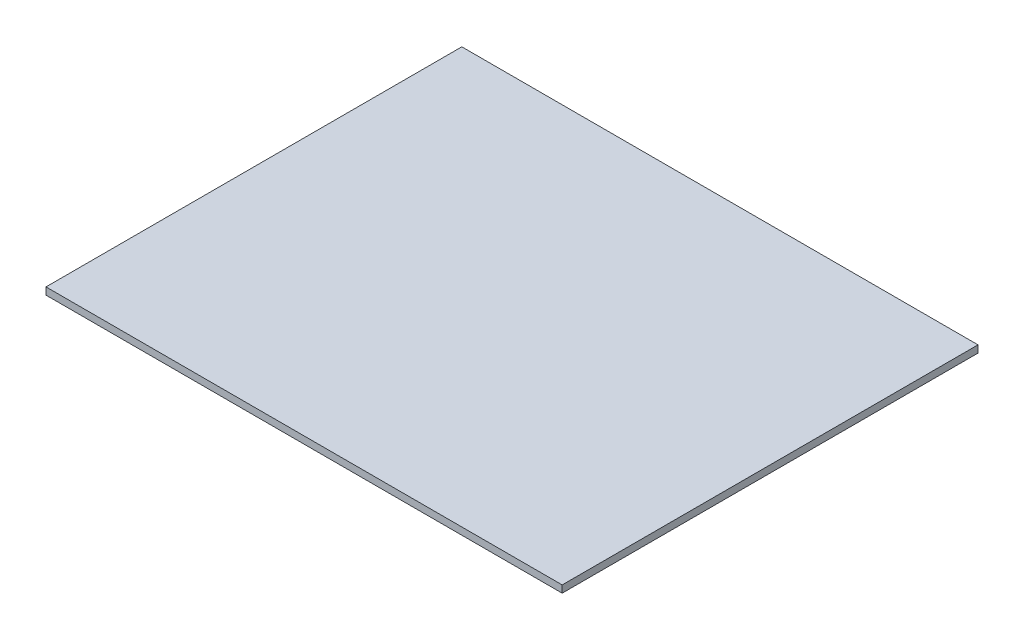
ISO-10303-21;
HEADER;
FILE_DESCRIPTION(('STEP AP214'),'2;1');
FILE_NAME('part.step','',(''),(''),'','','');
FILE_SCHEMA(('AUTOMOTIVE_DESIGN { 1 0 10303 214 1 1 1 1 }'));
ENDSEC;
DATA;
#1=APPLICATION_CONTEXT('core data for automotive mechanical design processes');
#2=APPLICATION_PROTOCOL_DEFINITION('international standard','automotive_design',2000,#1);
#3=PRODUCT_CONTEXT('',#1,'mechanical');
#4=PRODUCT('Part','Part','',(#3));
#5=PRODUCT_RELATED_PRODUCT_CATEGORY('part','',(#4));
#6=PRODUCT_DEFINITION_FORMATION('','',#4);
#7=PRODUCT_DEFINITION_CONTEXT('part definition',#1,'design');
#8=PRODUCT_DEFINITION('design','',#6,#7);
#9=PRODUCT_DEFINITION_SHAPE('','',#8);
#10=(LENGTH_UNIT() NAMED_UNIT(*) SI_UNIT(.MILLI.,.METRE.));
#11=(NAMED_UNIT(*) PLANE_ANGLE_UNIT() SI_UNIT($,.RADIAN.));
#12=(NAMED_UNIT(*) SI_UNIT($,.STERADIAN.) SOLID_ANGLE_UNIT());
#13=UNCERTAINTY_MEASURE_WITH_UNIT(LENGTH_MEASURE(1.E-05),#10,'distance_accuracy_value','');
#14=(GEOMETRIC_REPRESENTATION_CONTEXT(3) GLOBAL_UNCERTAINTY_ASSIGNED_CONTEXT((#13)) GLOBAL_UNIT_ASSIGNED_CONTEXT((#10,
#11,#12)) REPRESENTATION_CONTEXT('',''));
#15=CARTESIAN_POINT('',(0.,0.,0.));
#16=DIRECTION('',(0.,0.,1.));
#17=DIRECTION('',(1.,0.,0.));
#18=AXIS2_PLACEMENT_3D('',#15,#16,#17);
#19=CARTESIAN_POINT('',(180.,5.,-145.));
#20=DIRECTION('',(-1.,0.,0.));
#21=DIRECTION('',(0.,0.,1.));
#22=AXIS2_PLACEMENT_3D('',#19,#20,#21);
#23=PLANE('',#22);
#24=DIRECTION('',(0.,0.,-1.));
#25=VECTOR('',#24,1.);
#26=CARTESIAN_POINT('',(180.,0.,-145.));
#27=LINE('',#26,#25);
#28=CARTESIAN_POINT('',(180.,0.,145.));
#29=VERTEX_POINT('',#28);
#30=CARTESIAN_POINT('',(180.,0.,-145.));
#31=VERTEX_POINT('',#30);
#32=EDGE_CURVE('E96',#29,#31,#27,.T.);
#33=ORIENTED_EDGE('',*,*,#32,.T.);
#34=DIRECTION('',(0.,-1.,0.));
#35=VECTOR('',#34,1.);
#36=CARTESIAN_POINT('',(180.,5.,-145.));
#37=LINE('',#36,#35);
#38=CARTESIAN_POINT('',(180.,5.,-145.));
#39=VERTEX_POINT('',#38);
#40=EDGE_CURVE('E11',#39,#31,#37,.T.);
#41=ORIENTED_EDGE('',*,*,#40,.F.);
#42=DIRECTION('',(0.,0.,-1.));
#43=VECTOR('',#42,1.);
#44=CARTESIAN_POINT('',(180.,5.,-145.));
#45=LINE('',#44,#43);
#46=CARTESIAN_POINT('',(180.,5.,145.));
#47=VERTEX_POINT('',#46);
#48=EDGE_CURVE('E84',#47,#39,#45,.T.);
#49=ORIENTED_EDGE('',*,*,#48,.F.);
#50=DIRECTION('',(0.,-1.,0.));
#51=VECTOR('',#50,1.);
#52=CARTESIAN_POINT('',(180.,5.,145.));
#53=LINE('',#52,#51);
#54=EDGE_CURVE('E92',#47,#29,#53,.T.);
#55=ORIENTED_EDGE('',*,*,#54,.T.);
#56=EDGE_LOOP('',(#33,#41,#49,#55));
#57=FACE_BOUND('',#56,.T.);
#58=ADVANCED_FACE('F33',(#57),#23,.F.);
#59=CARTESIAN_POINT('',(180.,5.,-145.));
#60=DIRECTION('',(0.,0.,1.));
#61=DIRECTION('',(1.,0.,0.));
#62=AXIS2_PLACEMENT_3D('',#59,#60,#61);
#63=PLANE('',#62);
#64=DIRECTION('',(-1.,0.,0.));
#65=VECTOR('',#64,1.);
#66=CARTESIAN_POINT('',(180.,0.,-145.));
#67=LINE('',#66,#65);
#68=CARTESIAN_POINT('',(-180.,0.,-145.));
#69=VERTEX_POINT('',#68);
#70=EDGE_CURVE('E88',#31,#69,#67,.T.);
#71=ORIENTED_EDGE('',*,*,#70,.T.);
#72=DIRECTION('',(0.,-1.,0.));
#73=VECTOR('',#72,1.);
#74=CARTESIAN_POINT('',(-180.,5.,-145.));
#75=LINE('',#74,#73);
#76=CARTESIAN_POINT('',(-180.,5.,-145.));
#77=VERTEX_POINT('',#76);
#78=EDGE_CURVE('E41',#77,#69,#75,.T.);
#79=ORIENTED_EDGE('',*,*,#78,.F.);
#80=DIRECTION('',(-1.,0.,0.));
#81=VECTOR('',#80,1.);
#82=CARTESIAN_POINT('',(180.,5.,-145.));
#83=LINE('',#82,#81);
#84=EDGE_CURVE('E79',#39,#77,#83,.T.);
#85=ORIENTED_EDGE('',*,*,#84,.F.);
#86=ORIENTED_EDGE('',*,*,#40,.T.);
#87=EDGE_LOOP('',(#71,#79,#85,#86));
#88=FACE_BOUND('',#87,.T.);
#89=ADVANCED_FACE('F87',(#88),#63,.F.);
#90=CARTESIAN_POINT('',(-180.,5.,-145.));
#91=DIRECTION('',(1.,0.,0.));
#92=DIRECTION('',(0.,0.,-1.));
#93=AXIS2_PLACEMENT_3D('',#90,#91,#92);
#94=PLANE('',#93);
#95=DIRECTION('',(0.,0.,1.));
#96=VECTOR('',#95,1.);
#97=CARTESIAN_POINT('',(-180.,0.,-145.));
#98=LINE('',#97,#96);
#99=CARTESIAN_POINT('',(-180.,0.,145.));
#100=VERTEX_POINT('',#99);
#101=EDGE_CURVE('E66',#69,#100,#98,.T.);
#102=ORIENTED_EDGE('',*,*,#101,.T.);
#103=DIRECTION('',(0.,-1.,0.));
#104=VECTOR('',#103,1.);
#105=CARTESIAN_POINT('',(-180.,5.,145.));
#106=LINE('',#105,#104);
#107=CARTESIAN_POINT('',(-180.,5.,145.));
#108=VERTEX_POINT('',#107);
#109=EDGE_CURVE('E89',#108,#100,#106,.T.);
#110=ORIENTED_EDGE('',*,*,#109,.F.);
#111=DIRECTION('',(0.,0.,1.));
#112=VECTOR('',#111,1.);
#113=CARTESIAN_POINT('',(-180.,5.,-145.));
#114=LINE('',#113,#112);
#115=EDGE_CURVE('E82',#77,#108,#114,.T.);
#116=ORIENTED_EDGE('',*,*,#115,.F.);
#117=ORIENTED_EDGE('',*,*,#78,.T.);
#118=EDGE_LOOP('',(#102,#110,#116,#117));
#119=FACE_BOUND('',#118,.T.);
#120=ADVANCED_FACE('F90',(#119),#94,.F.);
#121=CARTESIAN_POINT('',(180.,5.,145.));
#122=DIRECTION('',(0.,0.,-1.));
#123=DIRECTION('',(-1.,0.,0.));
#124=AXIS2_PLACEMENT_3D('',#121,#122,#123);
#125=PLANE('',#124);
#126=DIRECTION('',(1.,0.,0.));
#127=VECTOR('',#126,1.);
#128=CARTESIAN_POINT('',(180.,0.,145.));
#129=LINE('',#128,#127);
#130=EDGE_CURVE('E72',#100,#29,#129,.T.);
#131=ORIENTED_EDGE('',*,*,#130,.T.);
#132=ORIENTED_EDGE('',*,*,#54,.F.);
#133=DIRECTION('',(1.,0.,0.));
#134=VECTOR('',#133,1.);
#135=CARTESIAN_POINT('',(180.,5.,145.));
#136=LINE('',#135,#134);
#137=EDGE_CURVE('E49',#108,#47,#136,.T.);
#138=ORIENTED_EDGE('',*,*,#137,.F.);
#139=ORIENTED_EDGE('',*,*,#109,.T.);
#140=EDGE_LOOP('',(#131,#132,#138,#139));
#141=FACE_BOUND('',#140,.T.);
#142=ADVANCED_FACE('F103',(#141),#125,.F.);
#143=CARTESIAN_POINT('',(0.,5.,0.));
#144=DIRECTION('',(0.,-1.,0.));
#145=DIRECTION('',(0.,0.,-1.));
#146=AXIS2_PLACEMENT_3D('',#143,#144,#145);
#147=PLANE('',#146);
#148=ORIENTED_EDGE('',*,*,#48,.T.);
#149=ORIENTED_EDGE('',*,*,#84,.T.);
#150=ORIENTED_EDGE('',*,*,#115,.T.);
#151=ORIENTED_EDGE('',*,*,#137,.T.);
#152=EDGE_LOOP('',(#148,#149,#150,#151));
#153=FACE_BOUND('',#152,.T.);
#154=ADVANCED_FACE('F80',(#153),#147,.F.);
#155=CARTESIAN_POINT('',(0.,0.,0.));
#156=DIRECTION('',(0.,-1.,0.));
#157=DIRECTION('',(0.,0.,-1.));
#158=AXIS2_PLACEMENT_3D('',#155,#156,#157);
#159=PLANE('',#158);
#160=ORIENTED_EDGE('',*,*,#32,.F.);
#161=ORIENTED_EDGE('',*,*,#130,.F.);
#162=ORIENTED_EDGE('',*,*,#101,.F.);
#163=ORIENTED_EDGE('',*,*,#70,.F.);
#164=EDGE_LOOP('',(#160,#161,#162,#163));
#165=FACE_BOUND('',#164,.T.);
#166=ADVANCED_FACE('F106',(#165),#159,.T.);
#167=CLOSED_SHELL('',(#58,#89,#120,#142,#154,#166));
#168=MANIFOLD_SOLID_BREP('B2',#167);
#169=ADVANCED_BREP_SHAPE_REPRESENTATION('',(#18,#168),#14);
#170=SHAPE_DEFINITION_REPRESENTATION(#9,#169);
ENDSEC;
END-ISO-10303-21;
